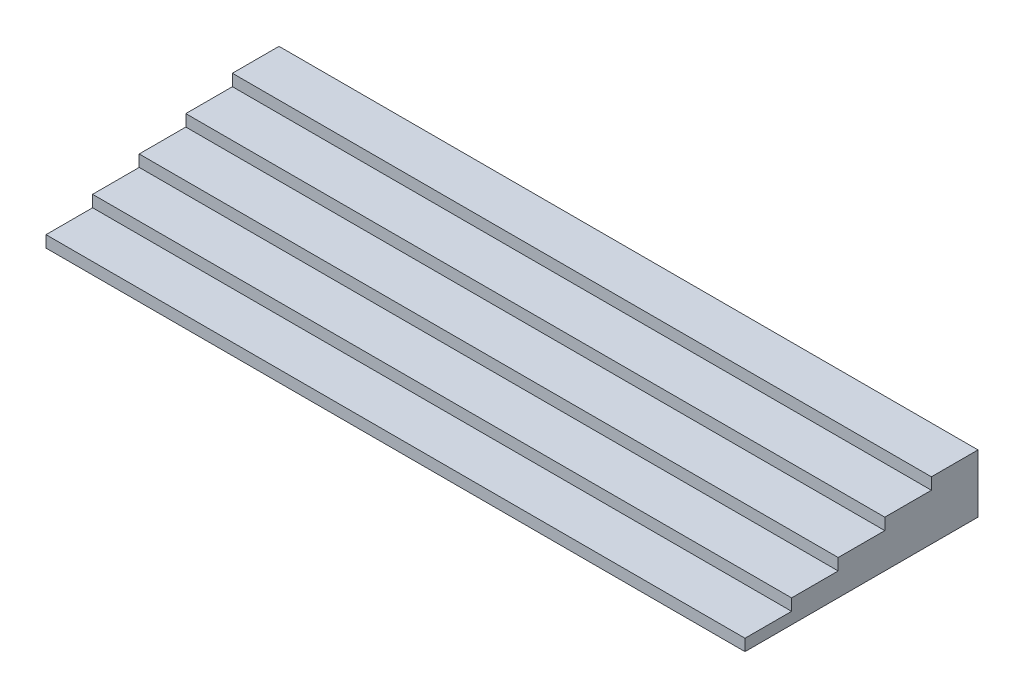
ISO-10303-21;
HEADER;
FILE_DESCRIPTION(('STEP AP214'),'2;1');
FILE_NAME('part.step','',(''),(''),'','','');
FILE_SCHEMA(('AUTOMOTIVE_DESIGN { 1 0 10303 214 1 1 1 1 }'));
ENDSEC;
DATA;
#1=APPLICATION_CONTEXT('core data for automotive mechanical design processes');
#2=APPLICATION_PROTOCOL_DEFINITION('international standard','automotive_design',2000,#1);
#3=PRODUCT_CONTEXT('',#1,'mechanical');
#4=PRODUCT('Part','Part','',(#3));
#5=PRODUCT_RELATED_PRODUCT_CATEGORY('part','',(#4));
#6=PRODUCT_DEFINITION_FORMATION('','',#4);
#7=PRODUCT_DEFINITION_CONTEXT('part definition',#1,'design');
#8=PRODUCT_DEFINITION('design','',#6,#7);
#9=PRODUCT_DEFINITION_SHAPE('','',#8);
#10=(LENGTH_UNIT() NAMED_UNIT(*) SI_UNIT(.MILLI.,.METRE.));
#11=(NAMED_UNIT(*) PLANE_ANGLE_UNIT() SI_UNIT($,.RADIAN.));
#12=(NAMED_UNIT(*) SI_UNIT($,.STERADIAN.) SOLID_ANGLE_UNIT());
#13=UNCERTAINTY_MEASURE_WITH_UNIT(LENGTH_MEASURE(1.E-05),#10,'distance_accuracy_value','');
#14=(GEOMETRIC_REPRESENTATION_CONTEXT(3) GLOBAL_UNCERTAINTY_ASSIGNED_CONTEXT((#13)) GLOBAL_UNIT_ASSIGNED_CONTEXT((#10,
#11,#12)) REPRESENTATION_CONTEXT('',''));
#15=CARTESIAN_POINT('',(0.,0.,0.));
#16=DIRECTION('',(0.,0.,1.));
#17=DIRECTION('',(1.,0.,0.));
#18=AXIS2_PLACEMENT_3D('',#15,#16,#17);
#19=CARTESIAN_POINT('',(0.,0.,0.));
#20=DIRECTION('',(-1.,0.,0.));
#21=DIRECTION('',(0.,0.,1.));
#22=AXIS2_PLACEMENT_3D('',#19,#20,#21);
#23=PLANE('',#22);
#24=DIRECTION('',(0.,1.,0.));
#25=VECTOR('',#24,1.);
#26=CARTESIAN_POINT('',(0.,0.,0.));
#27=LINE('',#26,#25);
#28=CARTESIAN_POINT('',(0.,0.,0.));
#29=VERTEX_POINT('',#28);
#30=CARTESIAN_POINT('',(0.,25.,0.));
#31=VERTEX_POINT('',#30);
#32=EDGE_CURVE('E245',#29,#31,#27,.T.);
#33=ORIENTED_EDGE('',*,*,#32,.T.);
#34=DIRECTION('',(0.,0.,-1.));
#35=VECTOR('',#34,1.);
#36=CARTESIAN_POINT('',(0.,25.,0.));
#37=LINE('',#36,#35);
#38=CARTESIAN_POINT('',(0.,25.,-100.));
#39=VERTEX_POINT('',#38);
#40=EDGE_CURVE('E26',#31,#39,#37,.T.);
#41=ORIENTED_EDGE('',*,*,#40,.T.);
#42=DIRECTION('',(0.,1.,0.));
#43=VECTOR('',#42,1.);
#44=CARTESIAN_POINT('',(0.,25.,-100.));
#45=LINE('',#44,#43);
#46=CARTESIAN_POINT('',(0.,50.,-100.));
#47=VERTEX_POINT('',#46);
#48=EDGE_CURVE('E174',#39,#47,#45,.T.);
#49=ORIENTED_EDGE('',*,*,#48,.T.);
#50=DIRECTION('',(0.,0.,-1.));
#51=VECTOR('',#50,1.);
#52=CARTESIAN_POINT('',(0.,50.,-100.));
#53=LINE('',#52,#51);
#54=CARTESIAN_POINT('',(0.,50.,-200.));
#55=VERTEX_POINT('',#54);
#56=EDGE_CURVE('E177',#47,#55,#53,.T.);
#57=ORIENTED_EDGE('',*,*,#56,.T.);
#58=DIRECTION('',(0.,1.,0.));
#59=VECTOR('',#58,1.);
#60=CARTESIAN_POINT('',(0.,50.,-200.));
#61=LINE('',#60,#59);
#62=CARTESIAN_POINT('',(0.,75.,-200.));
#63=VERTEX_POINT('',#62);
#64=EDGE_CURVE('E110',#55,#63,#61,.T.);
#65=ORIENTED_EDGE('',*,*,#64,.T.);
#66=DIRECTION('',(0.,0.,-1.));
#67=VECTOR('',#66,1.);
#68=CARTESIAN_POINT('',(0.,75.,-200.));
#69=LINE('',#68,#67);
#70=CARTESIAN_POINT('',(0.,75.,-300.));
#71=VERTEX_POINT('',#70);
#72=EDGE_CURVE('E190',#63,#71,#69,.T.);
#73=ORIENTED_EDGE('',*,*,#72,.T.);
#74=DIRECTION('',(0.,1.,0.));
#75=VECTOR('',#74,1.);
#76=CARTESIAN_POINT('',(0.,75.,-300.));
#77=LINE('',#76,#75);
#78=CARTESIAN_POINT('',(0.,100.,-300.));
#79=VERTEX_POINT('',#78);
#80=EDGE_CURVE('E231',#71,#79,#77,.T.);
#81=ORIENTED_EDGE('',*,*,#80,.T.);
#82=DIRECTION('',(0.,0.,-1.));
#83=VECTOR('',#82,1.);
#84=CARTESIAN_POINT('',(0.,100.,-300.));
#85=LINE('',#84,#83);
#86=CARTESIAN_POINT('',(0.,100.,-400.));
#87=VERTEX_POINT('',#86);
#88=EDGE_CURVE('E208',#79,#87,#85,.T.);
#89=ORIENTED_EDGE('',*,*,#88,.T.);
#90=DIRECTION('',(0.,1.,0.));
#91=VECTOR('',#90,1.);
#92=CARTESIAN_POINT('',(0.,100.,-400.));
#93=LINE('',#92,#91);
#94=CARTESIAN_POINT('',(0.,125.,-400.));
#95=VERTEX_POINT('',#94);
#96=EDGE_CURVE('E236',#87,#95,#93,.T.);
#97=ORIENTED_EDGE('',*,*,#96,.T.);
#98=DIRECTION('',(0.,0.,-1.));
#99=VECTOR('',#98,1.);
#100=CARTESIAN_POINT('',(0.,125.,-400.));
#101=LINE('',#100,#99);
#102=CARTESIAN_POINT('',(0.,125.,-500.));
#103=VERTEX_POINT('',#102);
#104=EDGE_CURVE('E218',#95,#103,#101,.T.);
#105=ORIENTED_EDGE('',*,*,#104,.T.);
#106=DIRECTION('',(0.,-1.,0.));
#107=VECTOR('',#106,1.);
#108=CARTESIAN_POINT('',(0.,125.,-500.));
#109=LINE('',#108,#107);
#110=CARTESIAN_POINT('',(0.,0.,-500.));
#111=VERTEX_POINT('',#110);
#112=EDGE_CURVE('E19',#103,#111,#109,.T.);
#113=ORIENTED_EDGE('',*,*,#112,.T.);
#114=DIRECTION('',(0.,0.,-1.));
#115=VECTOR('',#114,1.);
#116=CARTESIAN_POINT('',(0.,0.,0.));
#117=LINE('',#116,#115);
#118=EDGE_CURVE('E74',#29,#111,#117,.T.);
#119=ORIENTED_EDGE('',*,*,#118,.F.);
#120=EDGE_LOOP('',(#33,#41,#49,#57,#65,#73,#81,#89,#97,#105,#113,#119));
#121=FACE_BOUND('',#120,.T.);
#122=ADVANCED_FACE('F15',(#121),#23,.T.);
#123=CARTESIAN_POINT('',(1500.,0.,0.));
#124=DIRECTION('',(-1.,0.,0.));
#125=DIRECTION('',(0.,0.,1.));
#126=AXIS2_PLACEMENT_3D('',#123,#124,#125);
#127=PLANE('',#126);
#128=DIRECTION('',(0.,1.,0.));
#129=VECTOR('',#128,1.);
#130=CARTESIAN_POINT('',(1500.,0.,0.));
#131=LINE('',#130,#129);
#132=CARTESIAN_POINT('',(1500.,0.,0.));
#133=VERTEX_POINT('',#132);
#134=CARTESIAN_POINT('',(1500.,25.,0.));
#135=VERTEX_POINT('',#134);
#136=EDGE_CURVE('E244',#133,#135,#131,.T.);
#137=ORIENTED_EDGE('',*,*,#136,.F.);
#138=DIRECTION('',(0.,0.,1.));
#139=VECTOR('',#138,1.);
#140=CARTESIAN_POINT('',(1500.,0.,-500.));
#141=LINE('',#140,#139);
#142=CARTESIAN_POINT('',(1500.,0.,-500.));
#143=VERTEX_POINT('',#142);
#144=EDGE_CURVE('E211',#143,#133,#141,.T.);
#145=ORIENTED_EDGE('',*,*,#144,.F.);
#146=DIRECTION('',(0.,-1.,0.));
#147=VECTOR('',#146,1.);
#148=CARTESIAN_POINT('',(1500.,125.,-500.));
#149=LINE('',#148,#147);
#150=CARTESIAN_POINT('',(1500.,125.,-500.));
#151=VERTEX_POINT('',#150);
#152=EDGE_CURVE('E197',#151,#143,#149,.T.);
#153=ORIENTED_EDGE('',*,*,#152,.F.);
#154=DIRECTION('',(0.,0.,-1.));
#155=VECTOR('',#154,1.);
#156=CARTESIAN_POINT('',(1500.,125.,-400.));
#157=LINE('',#156,#155);
#158=CARTESIAN_POINT('',(1500.,125.,-400.));
#159=VERTEX_POINT('',#158);
#160=EDGE_CURVE('E225',#159,#151,#157,.T.);
#161=ORIENTED_EDGE('',*,*,#160,.F.);
#162=DIRECTION('',(0.,1.,0.));
#163=VECTOR('',#162,1.);
#164=CARTESIAN_POINT('',(1500.,100.,-400.));
#165=LINE('',#164,#163);
#166=CARTESIAN_POINT('',(1500.,100.,-400.));
#167=VERTEX_POINT('',#166);
#168=EDGE_CURVE('E228',#167,#159,#165,.T.);
#169=ORIENTED_EDGE('',*,*,#168,.F.);
#170=DIRECTION('',(0.,0.,-1.));
#171=VECTOR('',#170,1.);
#172=CARTESIAN_POINT('',(1500.,100.,-300.));
#173=LINE('',#172,#171);
#174=CARTESIAN_POINT('',(1500.,100.,-300.));
#175=VERTEX_POINT('',#174);
#176=EDGE_CURVE('E207',#175,#167,#173,.T.);
#177=ORIENTED_EDGE('',*,*,#176,.F.);
#178=DIRECTION('',(0.,1.,0.));
#179=VECTOR('',#178,1.);
#180=CARTESIAN_POINT('',(1500.,75.,-300.));
#181=LINE('',#180,#179);
#182=CARTESIAN_POINT('',(1500.,75.,-300.));
#183=VERTEX_POINT('',#182);
#184=EDGE_CURVE('E188',#183,#175,#181,.T.);
#185=ORIENTED_EDGE('',*,*,#184,.F.);
#186=DIRECTION('',(0.,0.,-1.));
#187=VECTOR('',#186,1.);
#188=CARTESIAN_POINT('',(1500.,75.,-200.));
#189=LINE('',#188,#187);
#190=CARTESIAN_POINT('',(1500.,75.,-200.));
#191=VERTEX_POINT('',#190);
#192=EDGE_CURVE('E100',#191,#183,#189,.T.);
#193=ORIENTED_EDGE('',*,*,#192,.F.);
#194=DIRECTION('',(0.,1.,0.));
#195=VECTOR('',#194,1.);
#196=CARTESIAN_POINT('',(1500.,50.,-200.));
#197=LINE('',#196,#195);
#198=CARTESIAN_POINT('',(1500.,50.,-200.));
#199=VERTEX_POINT('',#198);
#200=EDGE_CURVE('E169',#199,#191,#197,.T.);
#201=ORIENTED_EDGE('',*,*,#200,.F.);
#202=DIRECTION('',(0.,0.,-1.));
#203=VECTOR('',#202,1.);
#204=CARTESIAN_POINT('',(1500.,50.,-100.));
#205=LINE('',#204,#203);
#206=CARTESIAN_POINT('',(1500.,50.,-100.));
#207=VERTEX_POINT('',#206);
#208=EDGE_CURVE('E167',#207,#199,#205,.T.);
#209=ORIENTED_EDGE('',*,*,#208,.F.);
#210=DIRECTION('',(0.,1.,0.));
#211=VECTOR('',#210,1.);
#212=CARTESIAN_POINT('',(1500.,25.,-100.));
#213=LINE('',#212,#211);
#214=CARTESIAN_POINT('',(1500.,25.,-100.));
#215=VERTEX_POINT('',#214);
#216=EDGE_CURVE('E155',#215,#207,#213,.T.);
#217=ORIENTED_EDGE('',*,*,#216,.F.);
#218=DIRECTION('',(0.,0.,-1.));
#219=VECTOR('',#218,1.);
#220=CARTESIAN_POINT('',(1500.,25.,0.));
#221=LINE('',#220,#219);
#222=EDGE_CURVE('E9',#135,#215,#221,.T.);
#223=ORIENTED_EDGE('',*,*,#222,.F.);
#224=EDGE_LOOP('',(#137,#145,#153,#161,#169,#177,#185,#193,#201,#209,#217,#223));
#225=FACE_BOUND('',#224,.T.);
#226=ADVANCED_FACE('F17',(#225),#127,.F.);
#227=CARTESIAN_POINT('',(1500.,25.,0.));
#228=DIRECTION('',(0.,1.,0.));
#229=DIRECTION('',(1.,0.,0.));
#230=AXIS2_PLACEMENT_3D('',#227,#228,#229);
#231=PLANE('',#230);
#232=ORIENTED_EDGE('',*,*,#40,.F.);
#233=DIRECTION('',(-1.,0.,0.));
#234=VECTOR('',#233,1.);
#235=CARTESIAN_POINT('',(1500.,25.,0.));
#236=LINE('',#235,#234);
#237=EDGE_CURVE('E266',#135,#31,#236,.T.);
#238=ORIENTED_EDGE('',*,*,#237,.F.);
#239=ORIENTED_EDGE('',*,*,#222,.T.);
#240=DIRECTION('',(-1.,0.,0.));
#241=VECTOR('',#240,1.);
#242=CARTESIAN_POINT('',(1500.,25.,-100.));
#243=LINE('',#242,#241);
#244=EDGE_CURVE('E162',#215,#39,#243,.T.);
#245=ORIENTED_EDGE('',*,*,#244,.T.);
#246=EDGE_LOOP('',(#232,#238,#239,#245));
#247=FACE_BOUND('',#246,.T.);
#248=ADVANCED_FACE('F561',(#247),#231,.T.);
#249=CARTESIAN_POINT('',(1500.,25.,-100.));
#250=DIRECTION('',(0.,0.,1.));
#251=DIRECTION('',(1.,0.,0.));
#252=AXIS2_PLACEMENT_3D('',#249,#250,#251);
#253=PLANE('',#252);
#254=ORIENTED_EDGE('',*,*,#48,.F.);
#255=ORIENTED_EDGE('',*,*,#244,.F.);
#256=ORIENTED_EDGE('',*,*,#216,.T.);
#257=DIRECTION('',(-1.,0.,0.));
#258=VECTOR('',#257,1.);
#259=CARTESIAN_POINT('',(1500.,50.,-100.));
#260=LINE('',#259,#258);
#261=EDGE_CURVE('E160',#207,#47,#260,.T.);
#262=ORIENTED_EDGE('',*,*,#261,.T.);
#263=EDGE_LOOP('',(#254,#255,#256,#262));
#264=FACE_BOUND('',#263,.T.);
#265=ADVANCED_FACE('F158',(#264),#253,.T.);
#266=CARTESIAN_POINT('',(1500.,50.,-100.));
#267=DIRECTION('',(0.,1.,0.));
#268=DIRECTION('',(1.,0.,0.));
#269=AXIS2_PLACEMENT_3D('',#266,#267,#268);
#270=PLANE('',#269);
#271=ORIENTED_EDGE('',*,*,#56,.F.);
#272=ORIENTED_EDGE('',*,*,#261,.F.);
#273=ORIENTED_EDGE('',*,*,#208,.T.);
#274=DIRECTION('',(-1.,0.,0.));
#275=VECTOR('',#274,1.);
#276=CARTESIAN_POINT('',(1500.,50.,-200.));
#277=LINE('',#276,#275);
#278=EDGE_CURVE('E200',#199,#55,#277,.T.);
#279=ORIENTED_EDGE('',*,*,#278,.T.);
#280=EDGE_LOOP('',(#271,#272,#273,#279));
#281=FACE_BOUND('',#280,.T.);
#282=ADVANCED_FACE('F176',(#281),#270,.T.);
#283=CARTESIAN_POINT('',(1500.,50.,-200.));
#284=DIRECTION('',(0.,0.,1.));
#285=DIRECTION('',(1.,0.,0.));
#286=AXIS2_PLACEMENT_3D('',#283,#284,#285);
#287=PLANE('',#286);
#288=ORIENTED_EDGE('',*,*,#64,.F.);
#289=ORIENTED_EDGE('',*,*,#278,.F.);
#290=ORIENTED_EDGE('',*,*,#200,.T.);
#291=DIRECTION('',(-1.,0.,0.));
#292=VECTOR('',#291,1.);
#293=CARTESIAN_POINT('',(1500.,75.,-200.));
#294=LINE('',#293,#292);
#295=EDGE_CURVE('E241',#191,#63,#294,.T.);
#296=ORIENTED_EDGE('',*,*,#295,.T.);
#297=EDGE_LOOP('',(#288,#289,#290,#296));
#298=FACE_BOUND('',#297,.T.);
#299=ADVANCED_FACE('F503',(#298),#287,.T.);
#300=CARTESIAN_POINT('',(1500.,75.,-200.));
#301=DIRECTION('',(0.,1.,0.));
#302=DIRECTION('',(1.,0.,0.));
#303=AXIS2_PLACEMENT_3D('',#300,#301,#302);
#304=PLANE('',#303);
#305=ORIENTED_EDGE('',*,*,#72,.F.);
#306=ORIENTED_EDGE('',*,*,#295,.F.);
#307=ORIENTED_EDGE('',*,*,#192,.T.);
#308=DIRECTION('',(-1.,0.,0.));
#309=VECTOR('',#308,1.);
#310=CARTESIAN_POINT('',(1500.,75.,-300.));
#311=LINE('',#310,#309);
#312=EDGE_CURVE('E191',#183,#71,#311,.T.);
#313=ORIENTED_EDGE('',*,*,#312,.T.);
#314=EDGE_LOOP('',(#305,#306,#307,#313));
#315=FACE_BOUND('',#314,.T.);
#316=ADVANCED_FACE('F499',(#315),#304,.T.);
#317=CARTESIAN_POINT('',(1500.,75.,-300.));
#318=DIRECTION('',(0.,0.,1.));
#319=DIRECTION('',(1.,0.,0.));
#320=AXIS2_PLACEMENT_3D('',#317,#318,#319);
#321=PLANE('',#320);
#322=ORIENTED_EDGE('',*,*,#80,.F.);
#323=ORIENTED_EDGE('',*,*,#312,.F.);
#324=ORIENTED_EDGE('',*,*,#184,.T.);
#325=DIRECTION('',(-1.,0.,0.));
#326=VECTOR('',#325,1.);
#327=CARTESIAN_POINT('',(1500.,100.,-300.));
#328=LINE('',#327,#326);
#329=EDGE_CURVE('E203',#175,#79,#328,.T.);
#330=ORIENTED_EDGE('',*,*,#329,.T.);
#331=EDGE_LOOP('',(#322,#323,#324,#330));
#332=FACE_BOUND('',#331,.T.);
#333=ADVANCED_FACE('F457',(#332),#321,.T.);
#334=CARTESIAN_POINT('',(1500.,100.,-300.));
#335=DIRECTION('',(0.,1.,0.));
#336=DIRECTION('',(1.,0.,0.));
#337=AXIS2_PLACEMENT_3D('',#334,#335,#336);
#338=PLANE('',#337);
#339=ORIENTED_EDGE('',*,*,#88,.F.);
#340=ORIENTED_EDGE('',*,*,#329,.F.);
#341=ORIENTED_EDGE('',*,*,#176,.T.);
#342=DIRECTION('',(-1.,0.,0.));
#343=VECTOR('',#342,1.);
#344=CARTESIAN_POINT('',(1500.,100.,-400.));
#345=LINE('',#344,#343);
#346=EDGE_CURVE('E249',#167,#87,#345,.T.);
#347=ORIENTED_EDGE('',*,*,#346,.T.);
#348=EDGE_LOOP('',(#339,#340,#341,#347));
#349=FACE_BOUND('',#348,.T.);
#350=ADVANCED_FACE('F451',(#349),#338,.T.);
#351=CARTESIAN_POINT('',(1500.,100.,-400.));
#352=DIRECTION('',(0.,0.,1.));
#353=DIRECTION('',(1.,0.,0.));
#354=AXIS2_PLACEMENT_3D('',#351,#352,#353);
#355=PLANE('',#354);
#356=ORIENTED_EDGE('',*,*,#96,.F.);
#357=ORIENTED_EDGE('',*,*,#346,.F.);
#358=ORIENTED_EDGE('',*,*,#168,.T.);
#359=DIRECTION('',(-1.,0.,0.));
#360=VECTOR('',#359,1.);
#361=CARTESIAN_POINT('',(1500.,125.,-400.));
#362=LINE('',#361,#360);
#363=EDGE_CURVE('E221',#159,#95,#362,.T.);
#364=ORIENTED_EDGE('',*,*,#363,.T.);
#365=EDGE_LOOP('',(#356,#357,#358,#364));
#366=FACE_BOUND('',#365,.T.);
#367=ADVANCED_FACE('F456',(#366),#355,.T.);
#368=CARTESIAN_POINT('',(1500.,125.,-400.));
#369=DIRECTION('',(0.,1.,0.));
#370=DIRECTION('',(1.,0.,0.));
#371=AXIS2_PLACEMENT_3D('',#368,#369,#370);
#372=PLANE('',#371);
#373=ORIENTED_EDGE('',*,*,#104,.F.);
#374=ORIENTED_EDGE('',*,*,#363,.F.);
#375=ORIENTED_EDGE('',*,*,#160,.T.);
#376=DIRECTION('',(-1.,0.,0.));
#377=VECTOR('',#376,1.);
#378=CARTESIAN_POINT('',(1500.,125.,-500.));
#379=LINE('',#378,#377);
#380=EDGE_CURVE('E193',#151,#103,#379,.T.);
#381=ORIENTED_EDGE('',*,*,#380,.T.);
#382=EDGE_LOOP('',(#373,#374,#375,#381));
#383=FACE_BOUND('',#382,.T.);
#384=ADVANCED_FACE('F470',(#383),#372,.T.);
#385=CARTESIAN_POINT('',(1500.,125.,-500.));
#386=DIRECTION('',(0.,0.,-1.));
#387=DIRECTION('',(0.,-1.,0.));
#388=AXIS2_PLACEMENT_3D('',#385,#386,#387);
#389=PLANE('',#388);
#390=ORIENTED_EDGE('',*,*,#112,.F.);
#391=ORIENTED_EDGE('',*,*,#380,.F.);
#392=ORIENTED_EDGE('',*,*,#152,.T.);
#393=DIRECTION('',(-1.,0.,0.));
#394=VECTOR('',#393,1.);
#395=CARTESIAN_POINT('',(1500.,0.,-500.));
#396=LINE('',#395,#394);
#397=EDGE_CURVE('E213',#143,#111,#396,.T.);
#398=ORIENTED_EDGE('',*,*,#397,.T.);
#399=EDGE_LOOP('',(#390,#391,#392,#398));
#400=FACE_BOUND('',#399,.T.);
#401=ADVANCED_FACE('F465',(#400),#389,.T.);
#402=CARTESIAN_POINT('',(1500.,0.,0.));
#403=DIRECTION('',(0.,1.,0.));
#404=DIRECTION('',(0.,0.,-1.));
#405=AXIS2_PLACEMENT_3D('',#402,#403,#404);
#406=PLANE('',#405);
#407=ORIENTED_EDGE('',*,*,#118,.T.);
#408=ORIENTED_EDGE('',*,*,#397,.F.);
#409=ORIENTED_EDGE('',*,*,#144,.T.);
#410=DIRECTION('',(-1.,0.,0.));
#411=VECTOR('',#410,1.);
#412=CARTESIAN_POINT('',(1500.,0.,0.));
#413=LINE('',#412,#411);
#414=EDGE_CURVE('E242',#133,#29,#413,.T.);
#415=ORIENTED_EDGE('',*,*,#414,.T.);
#416=EDGE_LOOP('',(#407,#408,#409,#415));
#417=FACE_BOUND('',#416,.T.);
#418=ADVANCED_FACE('F469',(#417),#406,.F.);
#419=CARTESIAN_POINT('',(1500.,0.,0.));
#420=DIRECTION('',(0.,0.,1.));
#421=DIRECTION('',(1.,0.,0.));
#422=AXIS2_PLACEMENT_3D('',#419,#420,#421);
#423=PLANE('',#422);
#424=ORIENTED_EDGE('',*,*,#32,.F.);
#425=ORIENTED_EDGE('',*,*,#414,.F.);
#426=ORIENTED_EDGE('',*,*,#136,.T.);
#427=ORIENTED_EDGE('',*,*,#237,.T.);
#428=EDGE_LOOP('',(#424,#425,#426,#427));
#429=FACE_BOUND('',#428,.T.);
#430=ADVANCED_FACE('F488',(#429),#423,.T.);
#431=CLOSED_SHELL('',(#122,#226,#248,#265,#282,#299,#316,#333,#350,#367,#384,#401,#418,#430));
#432=MANIFOLD_SOLID_BREP('B1',#431);
#433=ADVANCED_BREP_SHAPE_REPRESENTATION('',(#18,#432),#14);
#434=SHAPE_DEFINITION_REPRESENTATION(#9,#433);
ENDSEC;
END-ISO-10303-21;
